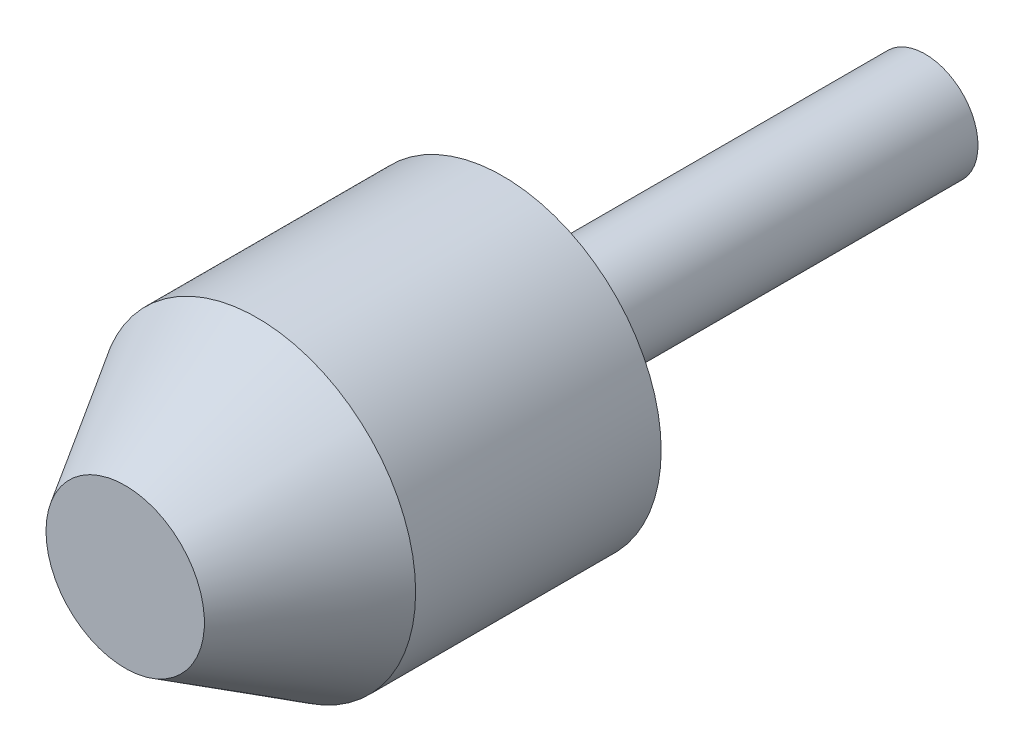
ISO-10303-21;
HEADER;
FILE_DESCRIPTION(('STEP AP214'),'2;1');
FILE_NAME('part.step','',(''),(''),'','','');
FILE_SCHEMA(('AUTOMOTIVE_DESIGN { 1 0 10303 214 1 1 1 1 }'));
ENDSEC;
DATA;
#1=APPLICATION_CONTEXT('core data for automotive mechanical design processes');
#2=APPLICATION_PROTOCOL_DEFINITION('international standard','automotive_design',2000,#1);
#3=PRODUCT_CONTEXT('',#1,'mechanical');
#4=PRODUCT('Part','Part','',(#3));
#5=PRODUCT_RELATED_PRODUCT_CATEGORY('part','',(#4));
#6=PRODUCT_DEFINITION_FORMATION('','',#4);
#7=PRODUCT_DEFINITION_CONTEXT('part definition',#1,'design');
#8=PRODUCT_DEFINITION('design','',#6,#7);
#9=PRODUCT_DEFINITION_SHAPE('','',#8);
#10=(LENGTH_UNIT() NAMED_UNIT(*) SI_UNIT(.MILLI.,.METRE.));
#11=(NAMED_UNIT(*) PLANE_ANGLE_UNIT() SI_UNIT($,.RADIAN.));
#12=(NAMED_UNIT(*) SI_UNIT($,.STERADIAN.) SOLID_ANGLE_UNIT());
#13=UNCERTAINTY_MEASURE_WITH_UNIT(LENGTH_MEASURE(1.E-05),#10,'distance_accuracy_value','');
#14=(GEOMETRIC_REPRESENTATION_CONTEXT(3) GLOBAL_UNCERTAINTY_ASSIGNED_CONTEXT((#13)) GLOBAL_UNIT_ASSIGNED_CONTEXT((#10,
#11,#12)) REPRESENTATION_CONTEXT('',''));
#15=CARTESIAN_POINT('',(0.,0.,0.));
#16=DIRECTION('',(0.,0.,1.));
#17=DIRECTION('',(1.,0.,0.));
#18=AXIS2_PLACEMENT_3D('',#15,#16,#17);
#19=CARTESIAN_POINT('',(0.,0.,16.));
#20=DIRECTION('',(0.,0.,-1.));
#21=DIRECTION('',(-1.,0.,0.));
#22=AXIS2_PLACEMENT_3D('',#19,#20,#21);
#23=CYLINDRICAL_SURFACE('',#22,2.);
#24=CARTESIAN_POINT('',(0.,0.,16.));
#25=DIRECTION('',(0.,0.,1.));
#26=DIRECTION('',(1.,0.,0.));
#27=AXIS2_PLACEMENT_3D('',#24,#25,#26);
#28=CIRCLE('',#27,2.);
#29=CARTESIAN_POINT('',(2.,0.,16.));
#30=VERTEX_POINT('',#29);
#31=EDGE_CURVE('E10',#30,#30,#28,.T.);
#32=ORIENTED_EDGE('',*,*,#31,.F.);
#33=EDGE_LOOP('',(#32));
#34=FACE_BOUND('',#33,.T.);
#35=CARTESIAN_POINT('',(0.,0.,0.));
#36=DIRECTION('',(0.,0.,1.));
#37=DIRECTION('',(1.,0.,0.));
#38=AXIS2_PLACEMENT_3D('',#35,#36,#37);
#39=CIRCLE('',#38,2.);
#40=CARTESIAN_POINT('',(2.,0.,0.));
#41=VERTEX_POINT('',#40);
#42=EDGE_CURVE('E36',#41,#41,#39,.T.);
#43=ORIENTED_EDGE('',*,*,#42,.T.);
#44=EDGE_LOOP('',(#43));
#45=FACE_BOUND('',#44,.T.);
#46=ADVANCED_FACE('F33',(#34,#45),#23,.T.);
#47=CARTESIAN_POINT('',(0.,0.,0.));
#48=DIRECTION('',(0.,0.,1.));
#49=DIRECTION('',(1.,0.,0.));
#50=AXIS2_PLACEMENT_3D('',#47,#48,#49);
#51=PLANE('',#50);
#52=ORIENTED_EDGE('',*,*,#42,.F.);
#53=EDGE_LOOP('',(#52));
#54=FACE_BOUND('',#53,.T.);
#55=ADVANCED_FACE('F67',(#54),#51,.F.);
#56=CARTESIAN_POINT('',(0.,0.,30.3));
#57=DIRECTION('',(0.,0.,-1.));
#58=DIRECTION('',(-1.,0.,0.));
#59=AXIS2_PLACEMENT_3D('',#56,#57,#58);
#60=CYLINDRICAL_SURFACE('',#59,6.);
#61=CARTESIAN_POINT('',(0.,0.,25.3));
#62=DIRECTION('',(0.,0.,-1.));
#63=DIRECTION('',(-1.,0.,0.));
#64=AXIS2_PLACEMENT_3D('',#61,#62,#63);
#65=CIRCLE('',#64,6.);
#66=CARTESIAN_POINT('',(-6.,0.,25.3));
#67=VERTEX_POINT('',#66);
#68=EDGE_CURVE('E47',#67,#67,#65,.T.);
#69=ORIENTED_EDGE('',*,*,#68,.T.);
#70=EDGE_LOOP('',(#69));
#71=FACE_BOUND('',#70,.T.);
#72=CARTESIAN_POINT('',(0.,0.,16.));
#73=DIRECTION('',(0.,0.,1.));
#74=DIRECTION('',(1.,0.,0.));
#75=AXIS2_PLACEMENT_3D('',#72,#73,#74);
#76=CIRCLE('',#75,6.);
#77=CARTESIAN_POINT('',(6.,0.,16.));
#78=VERTEX_POINT('',#77);
#79=EDGE_CURVE('E43',#78,#78,#76,.T.);
#80=ORIENTED_EDGE('',*,*,#79,.T.);
#81=EDGE_LOOP('',(#80));
#82=FACE_BOUND('',#81,.T.);
#83=ADVANCED_FACE('F72',(#71,#82),#60,.T.);
#84=CARTESIAN_POINT('',(0.,0.,16.));
#85=DIRECTION('',(0.,0.,1.));
#86=DIRECTION('',(1.,0.,0.));
#87=AXIS2_PLACEMENT_3D('',#84,#85,#86);
#88=PLANE('',#87);
#89=ORIENTED_EDGE('',*,*,#31,.T.);
#90=EDGE_LOOP('',(#89));
#91=FACE_BOUND('',#90,.T.);
#92=ORIENTED_EDGE('',*,*,#79,.F.);
#93=EDGE_LOOP('',(#92));
#94=FACE_BOUND('',#93,.T.);
#95=ADVANCED_FACE('F62',(#91,#94),#88,.F.);
#96=CARTESIAN_POINT('',(0.,0.,30.3));
#97=DIRECTION('',(0.,0.,-1.));
#98=DIRECTION('',(-1.,0.,0.));
#99=AXIS2_PLACEMENT_3D('',#96,#97,#98);
#100=CONICAL_SURFACE('',#99,3.,0.540419500270584);
#101=ORIENTED_EDGE('',*,*,#68,.F.);
#102=EDGE_LOOP('',(#101));
#103=FACE_BOUND('',#102,.T.);
#104=CARTESIAN_POINT('',(0.,0.,30.3));
#105=DIRECTION('',(0.,0.,-1.));
#106=DIRECTION('',(-1.,0.,0.));
#107=AXIS2_PLACEMENT_3D('',#104,#105,#106);
#108=CIRCLE('',#107,3.);
#109=CARTESIAN_POINT('',(-3.,0.,30.3));
#110=VERTEX_POINT('',#109);
#111=EDGE_CURVE('E50',#110,#110,#108,.T.);
#112=ORIENTED_EDGE('',*,*,#111,.T.);
#113=EDGE_LOOP('',(#112));
#114=FACE_BOUND('',#113,.T.);
#115=ADVANCED_FACE('F54',(#103,#114),#100,.T.);
#116=CARTESIAN_POINT('',(0.,0.,30.3));
#117=DIRECTION('',(0.,0.,1.));
#118=DIRECTION('',(1.,0.,0.));
#119=AXIS2_PLACEMENT_3D('',#116,#117,#118);
#120=PLANE('',#119);
#121=ORIENTED_EDGE('',*,*,#111,.F.);
#122=EDGE_LOOP('',(#121));
#123=FACE_BOUND('',#122,.T.);
#124=ADVANCED_FACE('F56',(#123),#120,.T.);
#125=CLOSED_SHELL('',(#46,#55,#83,#95,#115,#124));
#126=MANIFOLD_SOLID_BREP('B2',#125);
#127=ADVANCED_BREP_SHAPE_REPRESENTATION('',(#18,#126),#14);
#128=SHAPE_DEFINITION_REPRESENTATION(#9,#127);
ENDSEC;
END-ISO-10303-21;
